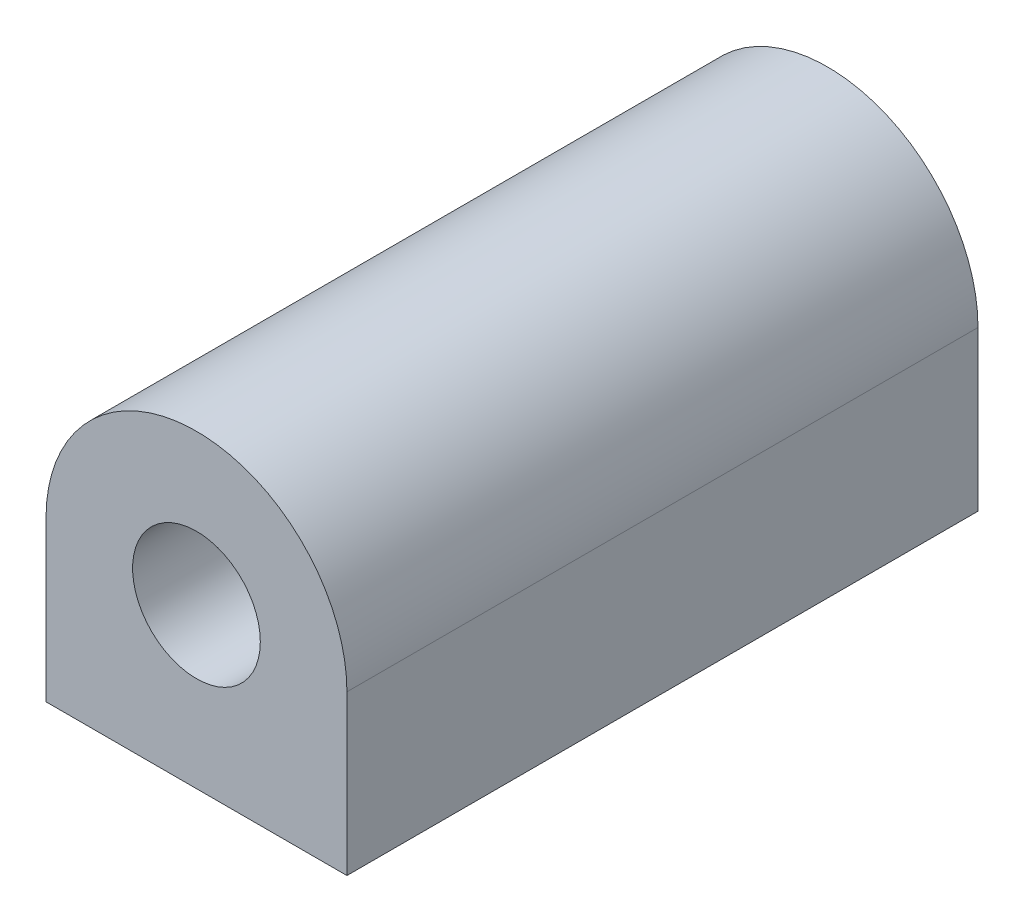
ISO-10303-21;
HEADER;
FILE_DESCRIPTION(('STEP AP214'),'2;1');
FILE_NAME('part.step','',(''),(''),'','','');
FILE_SCHEMA(('AUTOMOTIVE_DESIGN { 1 0 10303 214 1 1 1 1 }'));
ENDSEC;
DATA;
#1=APPLICATION_CONTEXT('core data for automotive mechanical design processes');
#2=APPLICATION_PROTOCOL_DEFINITION('international standard','automotive_design',2000,#1);
#3=PRODUCT_CONTEXT('',#1,'mechanical');
#4=PRODUCT('Part','Part','',(#3));
#5=PRODUCT_RELATED_PRODUCT_CATEGORY('part','',(#4));
#6=PRODUCT_DEFINITION_FORMATION('','',#4);
#7=PRODUCT_DEFINITION_CONTEXT('part definition',#1,'design');
#8=PRODUCT_DEFINITION('design','',#6,#7);
#9=PRODUCT_DEFINITION_SHAPE('','',#8);
#10=(LENGTH_UNIT() NAMED_UNIT(*) SI_UNIT(.MILLI.,.METRE.));
#11=(NAMED_UNIT(*) PLANE_ANGLE_UNIT() SI_UNIT($,.RADIAN.));
#12=(NAMED_UNIT(*) SI_UNIT($,.STERADIAN.) SOLID_ANGLE_UNIT());
#13=UNCERTAINTY_MEASURE_WITH_UNIT(LENGTH_MEASURE(1.E-05),#10,'distance_accuracy_value','');
#14=(GEOMETRIC_REPRESENTATION_CONTEXT(3) GLOBAL_UNCERTAINTY_ASSIGNED_CONTEXT((#13)) GLOBAL_UNIT_ASSIGNED_CONTEXT((#10,
#11,#12)) REPRESENTATION_CONTEXT('',''));
#15=CARTESIAN_POINT('',(0.,0.,0.));
#16=DIRECTION('',(0.,0.,1.));
#17=DIRECTION('',(1.,0.,0.));
#18=AXIS2_PLACEMENT_3D('',#15,#16,#17);
#19=CARTESIAN_POINT('',(0.,0.,14.575));
#20=DIRECTION('',(0.,0.,-1.));
#21=DIRECTION('',(-1.,0.,0.));
#22=AXIS2_PLACEMENT_3D('',#19,#20,#21);
#23=CYLINDRICAL_SURFACE('',#22,3.475);
#24=DIRECTION('',(0.,0.,-1.));
#25=VECTOR('',#24,1.);
#26=CARTESIAN_POINT('',(-3.475,0.,19.4893921292465));
#27=LINE('',#26,#25);
#28=CARTESIAN_POINT('',(-3.475,0.,14.575));
#29=VERTEX_POINT('',#28);
#30=CARTESIAN_POINT('',(-3.475,0.,0.));
#31=VERTEX_POINT('',#30);
#32=EDGE_CURVE('E105',#29,#31,#27,.T.);
#33=ORIENTED_EDGE('',*,*,#32,.F.);
#34=CARTESIAN_POINT('',(0.,0.,14.575));
#35=DIRECTION('',(0.,0.,1.));
#36=DIRECTION('',(1.,0.,0.));
#37=AXIS2_PLACEMENT_3D('',#34,#35,#36);
#38=CIRCLE('',#37,3.475);
#39=CARTESIAN_POINT('',(3.475,0.,14.575));
#40=VERTEX_POINT('',#39);
#41=EDGE_CURVE('E12',#40,#29,#38,.T.);
#42=ORIENTED_EDGE('',*,*,#41,.F.);
#43=DIRECTION('',(0.,0.,-1.));
#44=VECTOR('',#43,1.);
#45=CARTESIAN_POINT('',(3.475,0.,19.4893921292465));
#46=LINE('',#45,#44);
#47=CARTESIAN_POINT('',(3.475,0.,0.));
#48=VERTEX_POINT('',#47);
#49=EDGE_CURVE('E139',#40,#48,#46,.T.);
#50=ORIENTED_EDGE('',*,*,#49,.T.);
#51=CARTESIAN_POINT('',(0.,0.,0.));
#52=DIRECTION('',(0.,0.,1.));
#53=DIRECTION('',(1.,0.,0.));
#54=AXIS2_PLACEMENT_3D('',#51,#52,#53);
#55=CIRCLE('',#54,3.475);
#56=EDGE_CURVE('E64',#48,#31,#55,.T.);
#57=ORIENTED_EDGE('',*,*,#56,.T.);
#58=EDGE_LOOP('',(#33,#42,#50,#57));
#59=FACE_BOUND('',#58,.T.);
#60=ADVANCED_FACE('F61',(#59),#23,.T.);
#61=CARTESIAN_POINT('',(0.,0.,14.575));
#62=DIRECTION('',(0.,0.,1.));
#63=DIRECTION('',(1.,0.,0.));
#64=AXIS2_PLACEMENT_3D('',#61,#62,#63);
#65=PLANE('',#64);
#66=CARTESIAN_POINT('',(0.,0.,14.575));
#67=DIRECTION('',(0.,0.,1.));
#68=DIRECTION('',(1.,0.,0.));
#69=AXIS2_PLACEMENT_3D('',#66,#67,#68);
#70=CIRCLE('',#69,1.475);
#71=CARTESIAN_POINT('',(1.475,0.,14.575));
#72=VERTEX_POINT('',#71);
#73=EDGE_CURVE('E148',#72,#72,#70,.T.);
#74=ORIENTED_EDGE('',*,*,#73,.F.);
#75=EDGE_LOOP('',(#74));
#76=FACE_BOUND('',#75,.T.);
#77=ORIENTED_EDGE('',*,*,#41,.T.);
#78=DIRECTION('',(0.,-1.,0.));
#79=VECTOR('',#78,1.);
#80=CARTESIAN_POINT('',(-3.475,0.,14.575));
#81=LINE('',#80,#79);
#82=CARTESIAN_POINT('',(-3.475,-3.675,14.575));
#83=VERTEX_POINT('',#82);
#84=EDGE_CURVE('E107',#29,#83,#81,.T.);
#85=ORIENTED_EDGE('',*,*,#84,.T.);
#86=DIRECTION('',(-1.,0.,0.));
#87=VECTOR('',#86,1.);
#88=CARTESIAN_POINT('',(-3.475,-3.675,14.575));
#89=LINE('',#88,#87);
#90=CARTESIAN_POINT('',(3.475,-3.675,14.575));
#91=VERTEX_POINT('',#90);
#92=EDGE_CURVE('E123',#91,#83,#89,.T.);
#93=ORIENTED_EDGE('',*,*,#92,.F.);
#94=DIRECTION('',(0.,-1.,0.));
#95=VECTOR('',#94,1.);
#96=CARTESIAN_POINT('',(3.475,0.,14.575));
#97=LINE('',#96,#95);
#98=EDGE_CURVE('E140',#40,#91,#97,.T.);
#99=ORIENTED_EDGE('',*,*,#98,.F.);
#100=EDGE_LOOP('',(#77,#85,#93,#99));
#101=FACE_BOUND('',#100,.T.);
#102=ADVANCED_FACE('F157',(#76,#101),#65,.T.);
#103=CARTESIAN_POINT('',(0.,0.,0.));
#104=DIRECTION('',(0.,0.,1.));
#105=DIRECTION('',(1.,0.,0.));
#106=AXIS2_PLACEMENT_3D('',#103,#104,#105);
#107=PLANE('',#106);
#108=CARTESIAN_POINT('',(0.,0.,0.));
#109=DIRECTION('',(0.,0.,-1.));
#110=DIRECTION('',(-1.,0.,0.));
#111=AXIS2_PLACEMENT_3D('',#108,#109,#110);
#112=CIRCLE('',#111,1.475);
#113=CARTESIAN_POINT('',(-1.475,0.,0.));
#114=VERTEX_POINT('',#113);
#115=EDGE_CURVE('E142',#114,#114,#112,.T.);
#116=ORIENTED_EDGE('',*,*,#115,.F.);
#117=EDGE_LOOP('',(#116));
#118=FACE_BOUND('',#117,.T.);
#119=ORIENTED_EDGE('',*,*,#56,.F.);
#120=DIRECTION('',(0.,-1.,0.));
#121=VECTOR('',#120,1.);
#122=CARTESIAN_POINT('',(3.475,0.,0.));
#123=LINE('',#122,#121);
#124=CARTESIAN_POINT('',(3.475,-3.675,0.));
#125=VERTEX_POINT('',#124);
#126=EDGE_CURVE('E113',#48,#125,#123,.T.);
#127=ORIENTED_EDGE('',*,*,#126,.T.);
#128=DIRECTION('',(1.,0.,0.));
#129=VECTOR('',#128,1.);
#130=CARTESIAN_POINT('',(-3.475,-3.675,0.));
#131=LINE('',#130,#129);
#132=CARTESIAN_POINT('',(-3.475,-3.675,0.));
#133=VERTEX_POINT('',#132);
#134=EDGE_CURVE('E110',#133,#125,#131,.T.);
#135=ORIENTED_EDGE('',*,*,#134,.F.);
#136=DIRECTION('',(0.,-1.,0.));
#137=VECTOR('',#136,1.);
#138=CARTESIAN_POINT('',(-3.475,0.,0.));
#139=LINE('',#138,#137);
#140=EDGE_CURVE('E100',#31,#133,#139,.T.);
#141=ORIENTED_EDGE('',*,*,#140,.F.);
#142=EDGE_LOOP('',(#119,#127,#135,#141));
#143=FACE_BOUND('',#142,.T.);
#144=ADVANCED_FACE('F111',(#118,#143),#107,.F.);
#145=CARTESIAN_POINT('',(0.,0.,4.575));
#146=DIRECTION('',(0.,0.,1.));
#147=DIRECTION('',(1.,0.,0.));
#148=AXIS2_PLACEMENT_3D('',#145,#146,#147);
#149=CYLINDRICAL_SURFACE('',#148,1.475);
#150=ORIENTED_EDGE('',*,*,#115,.T.);
#151=EDGE_LOOP('',(#150));
#152=FACE_BOUND('',#151,.T.);
#153=ORIENTED_EDGE('',*,*,#73,.T.);
#154=EDGE_LOOP('',(#153));
#155=FACE_BOUND('',#154,.T.);
#156=ADVANCED_FACE('F165',(#152,#155),#149,.F.);
#157=CARTESIAN_POINT('',(3.475,0.,19.4893921292465));
#158=DIRECTION('',(1.,0.,0.));
#159=DIRECTION('',(0.,0.,-1.));
#160=AXIS2_PLACEMENT_3D('',#157,#158,#159);
#161=PLANE('',#160);
#162=ORIENTED_EDGE('',*,*,#49,.F.);
#163=ORIENTED_EDGE('',*,*,#98,.T.);
#164=DIRECTION('',(0.,0.,1.));
#165=VECTOR('',#164,1.);
#166=CARTESIAN_POINT('',(3.475,-3.675,14.575));
#167=LINE('',#166,#165);
#168=EDGE_CURVE('E118',#125,#91,#167,.T.);
#169=ORIENTED_EDGE('',*,*,#168,.F.);
#170=ORIENTED_EDGE('',*,*,#126,.F.);
#171=EDGE_LOOP('',(#162,#163,#169,#170));
#172=FACE_BOUND('',#171,.T.);
#173=ADVANCED_FACE('F155',(#172),#161,.T.);
#174=CARTESIAN_POINT('',(-3.475,0.,19.4893921292465));
#175=DIRECTION('',(1.,0.,0.));
#176=DIRECTION('',(0.,0.,-1.));
#177=AXIS2_PLACEMENT_3D('',#174,#175,#176);
#178=PLANE('',#177);
#179=ORIENTED_EDGE('',*,*,#84,.F.);
#180=ORIENTED_EDGE('',*,*,#32,.T.);
#181=ORIENTED_EDGE('',*,*,#140,.T.);
#182=DIRECTION('',(0.,0.,-1.));
#183=VECTOR('',#182,1.);
#184=CARTESIAN_POINT('',(-3.475,-3.675,14.575));
#185=LINE('',#184,#183);
#186=EDGE_CURVE('E104',#83,#133,#185,.T.);
#187=ORIENTED_EDGE('',*,*,#186,.F.);
#188=EDGE_LOOP('',(#179,#180,#181,#187));
#189=FACE_BOUND('',#188,.T.);
#190=ADVANCED_FACE('F102',(#189),#178,.F.);
#191=CARTESIAN_POINT('',(0.,-3.675,0.));
#192=DIRECTION('',(0.,-1.,0.));
#193=DIRECTION('',(0.,0.,-1.));
#194=AXIS2_PLACEMENT_3D('',#191,#192,#193);
#195=PLANE('',#194);
#196=ORIENTED_EDGE('',*,*,#186,.T.);
#197=ORIENTED_EDGE('',*,*,#134,.T.);
#198=ORIENTED_EDGE('',*,*,#168,.T.);
#199=ORIENTED_EDGE('',*,*,#92,.T.);
#200=EDGE_LOOP('',(#196,#197,#198,#199));
#201=FACE_BOUND('',#200,.T.);
#202=ADVANCED_FACE('F121',(#201),#195,.T.);
#203=CLOSED_SHELL('',(#60,#102,#144,#156,#173,#190,#202));
#204=MANIFOLD_SOLID_BREP('B2',#203);
#205=ADVANCED_BREP_SHAPE_REPRESENTATION('',(#18,#204),#14);
#206=SHAPE_DEFINITION_REPRESENTATION(#9,#205);
ENDSEC;
END-ISO-10303-21;
